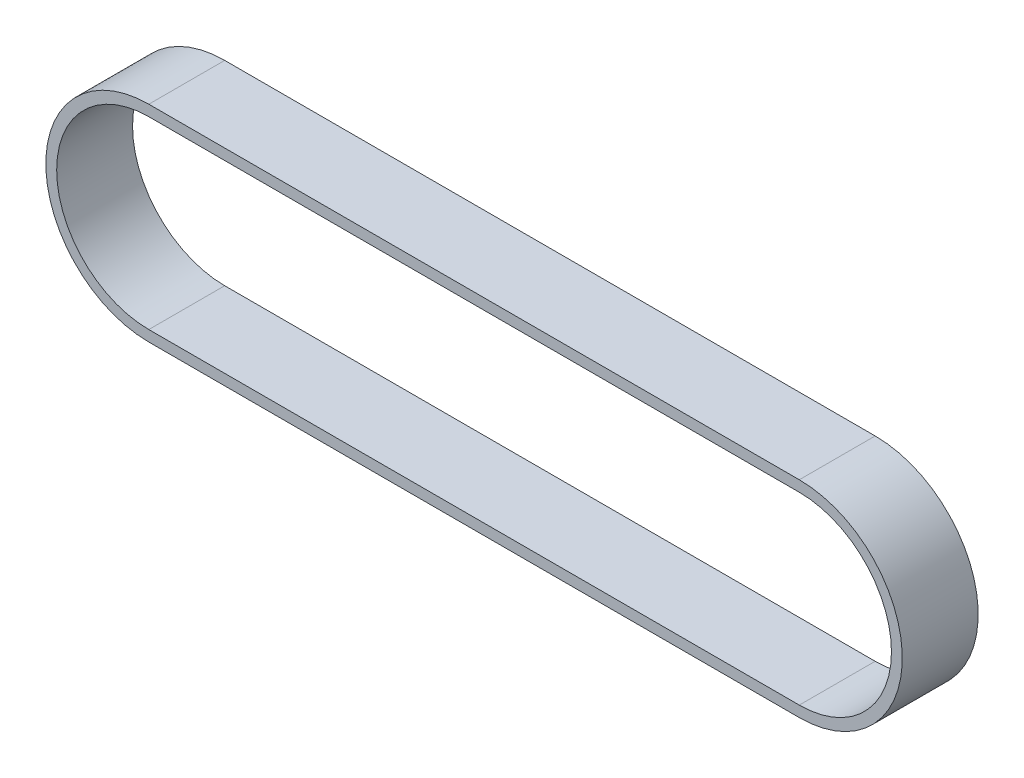
ISO-10303-21;
HEADER;
FILE_DESCRIPTION(('STEP AP214'),'2;1');
FILE_NAME('part.step','',(''),(''),'','','');
FILE_SCHEMA(('AUTOMOTIVE_DESIGN { 1 0 10303 214 1 1 1 1 }'));
ENDSEC;
DATA;
#1=APPLICATION_CONTEXT('core data for automotive mechanical design processes');
#2=APPLICATION_PROTOCOL_DEFINITION('international standard','automotive_design',2000,#1);
#3=PRODUCT_CONTEXT('',#1,'mechanical');
#4=PRODUCT('Part','Part','',(#3));
#5=PRODUCT_RELATED_PRODUCT_CATEGORY('part','',(#4));
#6=PRODUCT_DEFINITION_FORMATION('','',#4);
#7=PRODUCT_DEFINITION_CONTEXT('part definition',#1,'design');
#8=PRODUCT_DEFINITION('design','',#6,#7);
#9=PRODUCT_DEFINITION_SHAPE('','',#8);
#10=(LENGTH_UNIT() NAMED_UNIT(*) SI_UNIT(.MILLI.,.METRE.));
#11=(NAMED_UNIT(*) PLANE_ANGLE_UNIT() SI_UNIT($,.RADIAN.));
#12=(NAMED_UNIT(*) SI_UNIT($,.STERADIAN.) SOLID_ANGLE_UNIT());
#13=UNCERTAINTY_MEASURE_WITH_UNIT(LENGTH_MEASURE(1.E-05),#10,'distance_accuracy_value','');
#14=(GEOMETRIC_REPRESENTATION_CONTEXT(3) GLOBAL_UNCERTAINTY_ASSIGNED_CONTEXT((#13)) GLOBAL_UNIT_ASSIGNED_CONTEXT((#10,
#11,#12)) REPRESENTATION_CONTEXT('',''));
#15=CARTESIAN_POINT('',(0.,0.,0.));
#16=DIRECTION('',(0.,0.,1.));
#17=DIRECTION('',(1.,0.,0.));
#18=AXIS2_PLACEMENT_3D('',#15,#16,#17);
#19=CARTESIAN_POINT('',(-46.0545454545454,0.,7.));
#20=DIRECTION('',(0.,0.,1.));
#21=DIRECTION('',(1.,0.,0.));
#22=AXIS2_PLACEMENT_3D('',#19,#20,#21);
#23=PLANE('',#22);
#24=CARTESIAN_POINT('',(-46.0545454545454,0.,7.));
#25=DIRECTION('',(0.,0.,1.));
#26=DIRECTION('',(1.,0.,0.));
#27=AXIS2_PLACEMENT_3D('',#24,#25,#26);
#28=CIRCLE('',#27,19.);
#29=CARTESIAN_POINT('',(-46.0545454545454,19.,7.));
#30=VERTEX_POINT('',#29);
#31=CARTESIAN_POINT('',(-46.0545454545454,-19.,7.));
#32=VERTEX_POINT('',#31);
#33=EDGE_CURVE('E164',#30,#32,#28,.T.);
#34=ORIENTED_EDGE('',*,*,#33,.T.);
#35=DIRECTION('',(1.,0.,0.));
#36=VECTOR('',#35,1.);
#37=CARTESIAN_POINT('',(-46.0545454545454,-19.,7.));
#38=LINE('',#37,#36);
#39=CARTESIAN_POINT('',(73.9454545454546,-19.,7.));
#40=VERTEX_POINT('',#39);
#41=EDGE_CURVE('E167',#32,#40,#38,.T.);
#42=ORIENTED_EDGE('',*,*,#41,.T.);
#43=CARTESIAN_POINT('',(73.9454545454546,0.,7.));
#44=DIRECTION('',(0.,0.,1.));
#45=DIRECTION('',(1.,0.,0.));
#46=AXIS2_PLACEMENT_3D('',#43,#44,#45);
#47=CIRCLE('',#46,19.);
#48=CARTESIAN_POINT('',(73.9454545454546,19.,7.));
#49=VERTEX_POINT('',#48);
#50=EDGE_CURVE('E170',#40,#49,#47,.T.);
#51=ORIENTED_EDGE('',*,*,#50,.T.);
#52=DIRECTION('',(-1.,0.,0.));
#53=VECTOR('',#52,1.);
#54=CARTESIAN_POINT('',(-46.0545454545454,19.,7.));
#55=LINE('',#54,#53);
#56=EDGE_CURVE('E172',#49,#30,#55,.T.);
#57=ORIENTED_EDGE('',*,*,#56,.T.);
#58=EDGE_LOOP('',(#34,#42,#51,#57));
#59=FACE_BOUND('',#58,.T.);
#60=DIRECTION('',(1.,0.,0.));
#61=VECTOR('',#60,1.);
#62=CARTESIAN_POINT('',(-46.0545454545454,-17.,7.));
#63=LINE('',#62,#61);
#64=CARTESIAN_POINT('',(-46.0545454545454,-17.,7.));
#65=VERTEX_POINT('',#64);
#66=CARTESIAN_POINT('',(73.9454545454546,-17.,7.));
#67=VERTEX_POINT('',#66);
#68=EDGE_CURVE('E136',#65,#67,#63,.T.);
#69=ORIENTED_EDGE('',*,*,#68,.F.);
#70=CARTESIAN_POINT('',(-46.0545454545454,0.,7.));
#71=DIRECTION('',(0.,0.,1.));
#72=DIRECTION('',(1.,0.,0.));
#73=AXIS2_PLACEMENT_3D('',#70,#71,#72);
#74=CIRCLE('',#73,17.);
#75=CARTESIAN_POINT('',(-46.0545454545454,17.,7.));
#76=VERTEX_POINT('',#75);
#77=EDGE_CURVE('E128',#76,#65,#74,.T.);
#78=ORIENTED_EDGE('',*,*,#77,.F.);
#79=DIRECTION('',(-1.,0.,0.));
#80=VECTOR('',#79,1.);
#81=CARTESIAN_POINT('',(-46.0545454545454,17.,7.));
#82=LINE('',#81,#80);
#83=CARTESIAN_POINT('',(73.9454545454546,17.,7.));
#84=VERTEX_POINT('',#83);
#85=EDGE_CURVE('E150',#84,#76,#82,.T.);
#86=ORIENTED_EDGE('',*,*,#85,.F.);
#87=CARTESIAN_POINT('',(73.9454545454546,0.,7.));
#88=DIRECTION('',(0.,0.,1.));
#89=DIRECTION('',(1.,0.,0.));
#90=AXIS2_PLACEMENT_3D('',#87,#88,#89);
#91=CIRCLE('',#90,17.);
#92=EDGE_CURVE('E148',#67,#84,#91,.T.);
#93=ORIENTED_EDGE('',*,*,#92,.F.);
#94=EDGE_LOOP('',(#69,#78,#86,#93));
#95=FACE_BOUND('',#94,.T.);
#96=ADVANCED_FACE('F63',(#59,#95),#23,.T.);
#97=CARTESIAN_POINT('',(-46.0545454545454,0.,-7.));
#98=DIRECTION('',(0.,0.,1.));
#99=DIRECTION('',(1.,0.,0.));
#100=AXIS2_PLACEMENT_3D('',#97,#98,#99);
#101=PLANE('',#100);
#102=CARTESIAN_POINT('',(-46.0545454545454,0.,-7.));
#103=DIRECTION('',(0.,0.,1.));
#104=DIRECTION('',(1.,0.,0.));
#105=AXIS2_PLACEMENT_3D('',#102,#103,#104);
#106=CIRCLE('',#105,19.);
#107=CARTESIAN_POINT('',(-46.0545454545454,19.,-7.));
#108=VERTEX_POINT('',#107);
#109=CARTESIAN_POINT('',(-46.0545454545454,-19.,-7.));
#110=VERTEX_POINT('',#109);
#111=EDGE_CURVE('E144',#108,#110,#106,.T.);
#112=ORIENTED_EDGE('',*,*,#111,.F.);
#113=DIRECTION('',(-1.,0.,0.));
#114=VECTOR('',#113,1.);
#115=CARTESIAN_POINT('',(-46.0545454545454,19.,-7.));
#116=LINE('',#115,#114);
#117=CARTESIAN_POINT('',(73.9454545454546,19.,-7.));
#118=VERTEX_POINT('',#117);
#119=EDGE_CURVE('E168',#118,#108,#116,.T.);
#120=ORIENTED_EDGE('',*,*,#119,.F.);
#121=CARTESIAN_POINT('',(73.9454545454546,0.,-7.));
#122=DIRECTION('',(0.,0.,1.));
#123=DIRECTION('',(1.,0.,0.));
#124=AXIS2_PLACEMENT_3D('',#121,#122,#123);
#125=CIRCLE('',#124,19.);
#126=CARTESIAN_POINT('',(73.9454545454546,-19.,-7.));
#127=VERTEX_POINT('',#126);
#128=EDGE_CURVE('E179',#127,#118,#125,.T.);
#129=ORIENTED_EDGE('',*,*,#128,.F.);
#130=DIRECTION('',(1.,0.,0.));
#131=VECTOR('',#130,1.);
#132=CARTESIAN_POINT('',(-46.0545454545454,-19.,-7.));
#133=LINE('',#132,#131);
#134=EDGE_CURVE('E177',#110,#127,#133,.T.);
#135=ORIENTED_EDGE('',*,*,#134,.F.);
#136=EDGE_LOOP('',(#112,#120,#129,#135));
#137=FACE_BOUND('',#136,.T.);
#138=CARTESIAN_POINT('',(-46.0545454545454,0.,-7.));
#139=DIRECTION('',(0.,0.,1.));
#140=DIRECTION('',(1.,0.,0.));
#141=AXIS2_PLACEMENT_3D('',#138,#139,#140);
#142=CIRCLE('',#141,17.);
#143=CARTESIAN_POINT('',(-46.0545454545454,17.,-7.));
#144=VERTEX_POINT('',#143);
#145=CARTESIAN_POINT('',(-46.0545454545454,-17.,-7.));
#146=VERTEX_POINT('',#145);
#147=EDGE_CURVE('E86',#144,#146,#142,.T.);
#148=ORIENTED_EDGE('',*,*,#147,.T.);
#149=DIRECTION('',(1.,0.,0.));
#150=VECTOR('',#149,1.);
#151=CARTESIAN_POINT('',(-46.0545454545454,-17.,-7.));
#152=LINE('',#151,#150);
#153=CARTESIAN_POINT('',(73.9454545454546,-17.,-7.));
#154=VERTEX_POINT('',#153);
#155=EDGE_CURVE('E143',#146,#154,#152,.T.);
#156=ORIENTED_EDGE('',*,*,#155,.T.);
#157=CARTESIAN_POINT('',(73.9454545454546,0.,-7.));
#158=DIRECTION('',(0.,0.,1.));
#159=DIRECTION('',(1.,0.,0.));
#160=AXIS2_PLACEMENT_3D('',#157,#158,#159);
#161=CIRCLE('',#160,17.);
#162=CARTESIAN_POINT('',(73.9454545454546,17.,-7.));
#163=VERTEX_POINT('',#162);
#164=EDGE_CURVE('E156',#154,#163,#161,.T.);
#165=ORIENTED_EDGE('',*,*,#164,.T.);
#166=DIRECTION('',(-1.,0.,0.));
#167=VECTOR('',#166,1.);
#168=CARTESIAN_POINT('',(-46.0545454545454,17.,-7.));
#169=LINE('',#168,#167);
#170=EDGE_CURVE('E137',#163,#144,#169,.T.);
#171=ORIENTED_EDGE('',*,*,#170,.T.);
#172=EDGE_LOOP('',(#148,#156,#165,#171));
#173=FACE_BOUND('',#172,.T.);
#174=ADVANCED_FACE('F197',(#137,#173),#101,.F.);
#175=CARTESIAN_POINT('',(-46.0545454545454,0.,7.));
#176=DIRECTION('',(0.,0.,-1.));
#177=DIRECTION('',(-1.,0.,0.));
#178=AXIS2_PLACEMENT_3D('',#175,#176,#177);
#179=CYLINDRICAL_SURFACE('',#178,19.);
#180=ORIENTED_EDGE('',*,*,#111,.T.);
#181=DIRECTION('',(0.,0.,-1.));
#182=VECTOR('',#181,1.);
#183=CARTESIAN_POINT('',(-46.0545454545454,-19.,7.));
#184=LINE('',#183,#182);
#185=EDGE_CURVE('E12',#32,#110,#184,.T.);
#186=ORIENTED_EDGE('',*,*,#185,.F.);
#187=ORIENTED_EDGE('',*,*,#33,.F.);
#188=DIRECTION('',(0.,0.,-1.));
#189=VECTOR('',#188,1.);
#190=CARTESIAN_POINT('',(-46.0545454545454,19.,7.));
#191=LINE('',#190,#189);
#192=EDGE_CURVE('E174',#30,#108,#191,.T.);
#193=ORIENTED_EDGE('',*,*,#192,.T.);
#194=EDGE_LOOP('',(#180,#186,#187,#193));
#195=FACE_BOUND('',#194,.T.);
#196=ADVANCED_FACE('F65',(#195),#179,.T.);
#197=CARTESIAN_POINT('',(-46.0545454545454,-19.,7.));
#198=DIRECTION('',(0.,1.,0.));
#199=DIRECTION('',(0.,0.,1.));
#200=AXIS2_PLACEMENT_3D('',#197,#198,#199);
#201=PLANE('',#200);
#202=ORIENTED_EDGE('',*,*,#134,.T.);
#203=DIRECTION('',(0.,0.,-1.));
#204=VECTOR('',#203,1.);
#205=CARTESIAN_POINT('',(73.9454545454546,-19.,7.));
#206=LINE('',#205,#204);
#207=EDGE_CURVE('E71',#40,#127,#206,.T.);
#208=ORIENTED_EDGE('',*,*,#207,.F.);
#209=ORIENTED_EDGE('',*,*,#41,.F.);
#210=ORIENTED_EDGE('',*,*,#185,.T.);
#211=EDGE_LOOP('',(#202,#208,#209,#210));
#212=FACE_BOUND('',#211,.T.);
#213=ADVANCED_FACE('F207',(#212),#201,.F.);
#214=CARTESIAN_POINT('',(73.9454545454546,0.,7.));
#215=DIRECTION('',(0.,0.,-1.));
#216=DIRECTION('',(-1.,0.,0.));
#217=AXIS2_PLACEMENT_3D('',#214,#215,#216);
#218=CYLINDRICAL_SURFACE('',#217,19.);
#219=ORIENTED_EDGE('',*,*,#128,.T.);
#220=DIRECTION('',(0.,0.,-1.));
#221=VECTOR('',#220,1.);
#222=CARTESIAN_POINT('',(73.9454545454546,19.,7.));
#223=LINE('',#222,#221);
#224=EDGE_CURVE('E184',#49,#118,#223,.T.);
#225=ORIENTED_EDGE('',*,*,#224,.F.);
#226=ORIENTED_EDGE('',*,*,#50,.F.);
#227=ORIENTED_EDGE('',*,*,#207,.T.);
#228=EDGE_LOOP('',(#219,#225,#226,#227));
#229=FACE_BOUND('',#228,.T.);
#230=ADVANCED_FACE('F191',(#229),#218,.T.);
#231=CARTESIAN_POINT('',(-46.0545454545454,19.,7.));
#232=DIRECTION('',(0.,-1.,0.));
#233=DIRECTION('',(0.,0.,-1.));
#234=AXIS2_PLACEMENT_3D('',#231,#232,#233);
#235=PLANE('',#234);
#236=ORIENTED_EDGE('',*,*,#119,.T.);
#237=ORIENTED_EDGE('',*,*,#192,.F.);
#238=ORIENTED_EDGE('',*,*,#56,.F.);
#239=ORIENTED_EDGE('',*,*,#224,.T.);
#240=EDGE_LOOP('',(#236,#237,#238,#239));
#241=FACE_BOUND('',#240,.T.);
#242=ADVANCED_FACE('F201',(#241),#235,.F.);
#243=CARTESIAN_POINT('',(-46.0545454545454,0.,7.));
#244=DIRECTION('',(0.,0.,-1.));
#245=DIRECTION('',(-1.,0.,0.));
#246=AXIS2_PLACEMENT_3D('',#243,#244,#245);
#247=CYLINDRICAL_SURFACE('',#246,17.);
#248=ORIENTED_EDGE('',*,*,#147,.F.);
#249=DIRECTION('',(0.,0.,-1.));
#250=VECTOR('',#249,1.);
#251=CARTESIAN_POINT('',(-46.0545454545454,17.,7.));
#252=LINE('',#251,#250);
#253=EDGE_CURVE('E132',#76,#144,#252,.T.);
#254=ORIENTED_EDGE('',*,*,#253,.F.);
#255=ORIENTED_EDGE('',*,*,#77,.T.);
#256=DIRECTION('',(0.,0.,-1.));
#257=VECTOR('',#256,1.);
#258=CARTESIAN_POINT('',(-46.0545454545454,-17.,7.));
#259=LINE('',#258,#257);
#260=EDGE_CURVE('E131',#65,#146,#259,.T.);
#261=ORIENTED_EDGE('',*,*,#260,.T.);
#262=EDGE_LOOP('',(#248,#254,#255,#261));
#263=FACE_BOUND('',#262,.T.);
#264=ADVANCED_FACE('F130',(#263),#247,.F.);
#265=CARTESIAN_POINT('',(-46.0545454545454,-17.,7.));
#266=DIRECTION('',(0.,1.,0.));
#267=DIRECTION('',(0.,0.,1.));
#268=AXIS2_PLACEMENT_3D('',#265,#266,#267);
#269=PLANE('',#268);
#270=ORIENTED_EDGE('',*,*,#155,.F.);
#271=ORIENTED_EDGE('',*,*,#260,.F.);
#272=ORIENTED_EDGE('',*,*,#68,.T.);
#273=DIRECTION('',(0.,0.,-1.));
#274=VECTOR('',#273,1.);
#275=CARTESIAN_POINT('',(73.9454545454546,-17.,7.));
#276=LINE('',#275,#274);
#277=EDGE_CURVE('E145',#67,#154,#276,.T.);
#278=ORIENTED_EDGE('',*,*,#277,.T.);
#279=EDGE_LOOP('',(#270,#271,#272,#278));
#280=FACE_BOUND('',#279,.T.);
#281=ADVANCED_FACE('F140',(#280),#269,.T.);
#282=CARTESIAN_POINT('',(73.9454545454546,0.,7.));
#283=DIRECTION('',(0.,0.,-1.));
#284=DIRECTION('',(-1.,0.,0.));
#285=AXIS2_PLACEMENT_3D('',#282,#283,#284);
#286=CYLINDRICAL_SURFACE('',#285,17.);
#287=ORIENTED_EDGE('',*,*,#164,.F.);
#288=ORIENTED_EDGE('',*,*,#277,.F.);
#289=ORIENTED_EDGE('',*,*,#92,.T.);
#290=DIRECTION('',(0.,0.,-1.));
#291=VECTOR('',#290,1.);
#292=CARTESIAN_POINT('',(73.9454545454546,17.,7.));
#293=LINE('',#292,#291);
#294=EDGE_CURVE('E78',#84,#163,#293,.T.);
#295=ORIENTED_EDGE('',*,*,#294,.T.);
#296=EDGE_LOOP('',(#287,#288,#289,#295));
#297=FACE_BOUND('',#296,.T.);
#298=ADVANCED_FACE('F230',(#297),#286,.F.);
#299=CARTESIAN_POINT('',(-46.0545454545454,17.,7.));
#300=DIRECTION('',(0.,-1.,0.));
#301=DIRECTION('',(0.,0.,-1.));
#302=AXIS2_PLACEMENT_3D('',#299,#300,#301);
#303=PLANE('',#302);
#304=ORIENTED_EDGE('',*,*,#170,.F.);
#305=ORIENTED_EDGE('',*,*,#294,.F.);
#306=ORIENTED_EDGE('',*,*,#85,.T.);
#307=ORIENTED_EDGE('',*,*,#253,.T.);
#308=EDGE_LOOP('',(#304,#305,#306,#307));
#309=FACE_BOUND('',#308,.T.);
#310=ADVANCED_FACE('F234',(#309),#303,.T.);
#311=CLOSED_SHELL('',(#96,#174,#196,#213,#230,#242,#264,#281,#298,#310));
#312=MANIFOLD_SOLID_BREP('B2',#311);
#313=ADVANCED_BREP_SHAPE_REPRESENTATION('',(#18,#312),#14);
#314=SHAPE_DEFINITION_REPRESENTATION(#9,#313);
ENDSEC;
END-ISO-10303-21;
